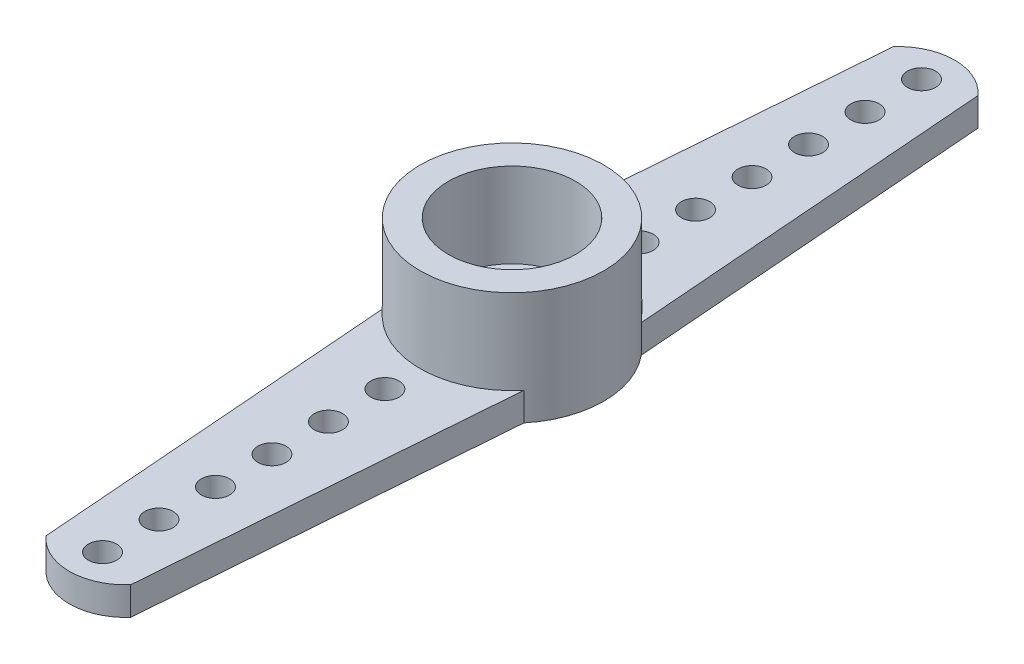
ISO-10303-21;
HEADER;
FILE_DESCRIPTION(('STEP AP214'),'2;1');
FILE_NAME('part.step','',(''),(''),'','','');
FILE_SCHEMA(('AUTOMOTIVE_DESIGN { 1 0 10303 214 1 1 1 1 }'));
ENDSEC;
DATA;
#1=APPLICATION_CONTEXT('core data for automotive mechanical design processes');
#2=APPLICATION_PROTOCOL_DEFINITION('international standard','automotive_design',2000,#1);
#3=PRODUCT_CONTEXT('',#1,'mechanical');
#4=PRODUCT('Part','Part','',(#3));
#5=PRODUCT_RELATED_PRODUCT_CATEGORY('part','',(#4));
#6=PRODUCT_DEFINITION_FORMATION('','',#4);
#7=PRODUCT_DEFINITION_CONTEXT('part definition',#1,'design');
#8=PRODUCT_DEFINITION('design','',#6,#7);
#9=PRODUCT_DEFINITION_SHAPE('','',#8);
#10=(LENGTH_UNIT() NAMED_UNIT(*) SI_UNIT(.MILLI.,.METRE.));
#11=(NAMED_UNIT(*) PLANE_ANGLE_UNIT() SI_UNIT($,.RADIAN.));
#12=(NAMED_UNIT(*) SI_UNIT($,.STERADIAN.) SOLID_ANGLE_UNIT());
#13=UNCERTAINTY_MEASURE_WITH_UNIT(LENGTH_MEASURE(1.E-05),#10,'distance_accuracy_value','');
#14=(GEOMETRIC_REPRESENTATION_CONTEXT(3) GLOBAL_UNCERTAINTY_ASSIGNED_CONTEXT((#13)) GLOBAL_UNIT_ASSIGNED_CONTEXT((#10,
#11,#12)) REPRESENTATION_CONTEXT('',''));
#15=CARTESIAN_POINT('',(0.,0.,0.));
#16=DIRECTION('',(0.,0.,1.));
#17=DIRECTION('',(1.,0.,0.));
#18=AXIS2_PLACEMENT_3D('',#15,#16,#17);
#19=CARTESIAN_POINT('',(0.,4.,0.));
#20=DIRECTION('',(0.,-1.,0.));
#21=DIRECTION('',(0.,0.,-1.));
#22=AXIS2_PLACEMENT_3D('',#19,#20,#21);
#23=CYLINDRICAL_SURFACE('',#22,3.25);
#24=CARTESIAN_POINT('',(0.,4.,0.));
#25=DIRECTION('',(0.,1.,0.));
#26=DIRECTION('',(0.,0.,1.));
#27=AXIS2_PLACEMENT_3D('',#24,#25,#26);
#28=CIRCLE('',#27,3.25);
#29=CARTESIAN_POINT('',(0.,4.,3.25));
#30=VERTEX_POINT('',#29);
#31=EDGE_CURVE('E47',#30,#30,#28,.T.);
#32=ORIENTED_EDGE('',*,*,#31,.F.);
#33=EDGE_LOOP('',(#32));
#34=FACE_BOUND('',#33,.T.);
#35=CARTESIAN_POINT('',(0.,0.,0.));
#36=DIRECTION('',(0.,1.,0.));
#37=DIRECTION('',(0.,0.,1.));
#38=AXIS2_PLACEMENT_3D('',#35,#36,#37);
#39=CIRCLE('',#38,3.25);
#40=CARTESIAN_POINT('',(-2.5,0.,-2.07665596572952));
#41=VERTEX_POINT('',#40);
#42=CARTESIAN_POINT('',(-2.5,0.,2.07665596572952));
#43=VERTEX_POINT('',#42);
#44=EDGE_CURVE('E232',#41,#43,#39,.T.);
#45=ORIENTED_EDGE('',*,*,#44,.T.);
#46=DIRECTION('',(0.,-1.,0.));
#47=VECTOR('',#46,1.);
#48=CARTESIAN_POINT('',(-2.5,1.,2.07665596572952));
#49=LINE('',#48,#47);
#50=CARTESIAN_POINT('',(-2.5,1.,2.07665596572952));
#51=VERTEX_POINT('',#50);
#52=EDGE_CURVE('E59',#51,#43,#49,.T.);
#53=ORIENTED_EDGE('',*,*,#52,.F.);
#54=CARTESIAN_POINT('',(0.,1.,0.));
#55=DIRECTION('',(0.,1.,0.));
#56=DIRECTION('',(0.,0.,1.));
#57=AXIS2_PLACEMENT_3D('',#54,#55,#56);
#58=CIRCLE('',#57,3.25);
#59=CARTESIAN_POINT('',(2.5,1.,2.07665596572952));
#60=VERTEX_POINT('',#59);
#61=EDGE_CURVE('E54',#51,#60,#58,.T.);
#62=ORIENTED_EDGE('',*,*,#61,.T.);
#63=DIRECTION('',(0.,-1.,0.));
#64=VECTOR('',#63,1.);
#65=CARTESIAN_POINT('',(2.5,1.,2.07665596572952));
#66=LINE('',#65,#64);
#67=CARTESIAN_POINT('',(2.5,0.,2.07665596572952));
#68=VERTEX_POINT('',#67);
#69=EDGE_CURVE('E160',#60,#68,#66,.T.);
#70=ORIENTED_EDGE('',*,*,#69,.T.);
#71=CARTESIAN_POINT('',(2.5,0.,-2.07665596572952));
#72=VERTEX_POINT('',#71);
#73=EDGE_CURVE('E228',#68,#72,#39,.T.);
#74=ORIENTED_EDGE('',*,*,#73,.T.);
#75=DIRECTION('',(0.,-1.,0.));
#76=VECTOR('',#75,1.);
#77=CARTESIAN_POINT('',(2.5,1.,-2.07665596572952));
#78=LINE('',#77,#76);
#79=CARTESIAN_POINT('',(2.5,1.,-2.07665596572952));
#80=VERTEX_POINT('',#79);
#81=EDGE_CURVE('E220',#80,#72,#78,.T.);
#82=ORIENTED_EDGE('',*,*,#81,.F.);
#83=CARTESIAN_POINT('',(0.,1.,0.));
#84=DIRECTION('',(0.,1.,0.));
#85=DIRECTION('',(0.,0.,1.));
#86=AXIS2_PLACEMENT_3D('',#83,#84,#85);
#87=CIRCLE('',#86,3.25);
#88=CARTESIAN_POINT('',(-2.5,1.,-2.07665596572952));
#89=VERTEX_POINT('',#88);
#90=EDGE_CURVE('E179',#80,#89,#87,.T.);
#91=ORIENTED_EDGE('',*,*,#90,.T.);
#92=DIRECTION('',(0.,-1.,0.));
#93=VECTOR('',#92,1.);
#94=CARTESIAN_POINT('',(-2.5,1.,-2.07665596572952));
#95=LINE('',#94,#93);
#96=EDGE_CURVE('E223',#89,#41,#95,.T.);
#97=ORIENTED_EDGE('',*,*,#96,.T.);
#98=EDGE_LOOP('',(#45,#53,#62,#70,#74,#82,#91,#97));
#99=FACE_BOUND('',#98,.T.);
#100=ADVANCED_FACE('F39',(#34,#99),#23,.T.);
#101=CARTESIAN_POINT('',(0.,4.,0.));
#102=DIRECTION('',(0.,-1.,0.));
#103=DIRECTION('',(0.,0.,-1.));
#104=AXIS2_PLACEMENT_3D('',#101,#102,#103);
#105=CYLINDRICAL_SURFACE('',#104,2.25);
#106=CARTESIAN_POINT('',(0.,1.,0.));
#107=DIRECTION('',(0.,1.,0.));
#108=DIRECTION('',(0.,0.,1.));
#109=AXIS2_PLACEMENT_3D('',#106,#107,#108);
#110=CIRCLE('',#109,2.25);
#111=CARTESIAN_POINT('',(0.,1.,2.25));
#112=VERTEX_POINT('',#111);
#113=EDGE_CURVE('E11',#112,#112,#110,.T.);
#114=ORIENTED_EDGE('',*,*,#113,.F.);
#115=EDGE_LOOP('',(#114));
#116=FACE_BOUND('',#115,.T.);
#117=CARTESIAN_POINT('',(0.,4.,0.));
#118=DIRECTION('',(0.,1.,0.));
#119=DIRECTION('',(0.,0.,1.));
#120=AXIS2_PLACEMENT_3D('',#117,#118,#119);
#121=CIRCLE('',#120,2.25);
#122=CARTESIAN_POINT('',(0.,4.,2.25));
#123=VERTEX_POINT('',#122);
#124=EDGE_CURVE('E229',#123,#123,#121,.T.);
#125=ORIENTED_EDGE('',*,*,#124,.T.);
#126=EDGE_LOOP('',(#125));
#127=FACE_BOUND('',#126,.T.);
#128=ADVANCED_FACE('F41',(#116,#127),#105,.F.);
#129=CARTESIAN_POINT('',(0.,4.,0.));
#130=DIRECTION('',(0.,1.,0.));
#131=DIRECTION('',(0.,0.,1.));
#132=AXIS2_PLACEMENT_3D('',#129,#130,#131);
#133=PLANE('',#132);
#134=ORIENTED_EDGE('',*,*,#124,.F.);
#135=EDGE_LOOP('',(#134));
#136=FACE_BOUND('',#135,.T.);
#137=ORIENTED_EDGE('',*,*,#31,.T.);
#138=EDGE_LOOP('',(#137));
#139=FACE_BOUND('',#138,.T.);
#140=ADVANCED_FACE('F273',(#136,#139),#133,.T.);
#141=CARTESIAN_POINT('',(0.,0.,0.));
#142=DIRECTION('',(0.,1.,0.));
#143=DIRECTION('',(0.,0.,1.));
#144=AXIS2_PLACEMENT_3D('',#141,#142,#143);
#145=PLANE('',#144);
#146=ORIENTED_EDGE('',*,*,#44,.F.);
#147=DIRECTION('',(-0.0771487312096737,0.,0.997019595230072));
#148=VECTOR('',#147,1.);
#149=CARTESIAN_POINT('',(-2.64485406135684,0.,-0.204657096053711));
#150=LINE('',#149,#148);
#151=CARTESIAN_POINT('',(-1.5,0.,-15.));
#152=VERTEX_POINT('',#151);
#153=EDGE_CURVE('E205',#152,#41,#150,.T.);
#154=ORIENTED_EDGE('',*,*,#153,.F.);
#155=CARTESIAN_POINT('',(0.,0.,-13.6771243444677));
#156=DIRECTION('',(0.,1.,0.));
#157=DIRECTION('',(0.,0.,1.));
#158=AXIS2_PLACEMENT_3D('',#155,#156,#157);
#159=CIRCLE('',#158,2.);
#160=CARTESIAN_POINT('',(1.5,0.,-15.));
#161=VERTEX_POINT('',#160);
#162=EDGE_CURVE('E202',#152,#161,#159,.F.);
#163=ORIENTED_EDGE('',*,*,#162,.T.);
#164=DIRECTION('',(0.0771487312096736,0.,0.997019595230073));
#165=VECTOR('',#164,1.);
#166=CARTESIAN_POINT('',(2.64485406135684,0.,-0.204657096053711));
#167=LINE('',#166,#165);
#168=EDGE_CURVE('E208',#161,#72,#167,.T.);
#169=ORIENTED_EDGE('',*,*,#168,.T.);
#170=ORIENTED_EDGE('',*,*,#73,.F.);
#171=DIRECTION('',(0.0771487312096736,0.,-0.997019595230073));
#172=VECTOR('',#171,1.);
#173=CARTESIAN_POINT('',(2.64485406135684,0.,0.204657096053711));
#174=LINE('',#173,#172);
#175=CARTESIAN_POINT('',(1.5,0.,15.));
#176=VERTEX_POINT('',#175);
#177=EDGE_CURVE('E155',#176,#68,#174,.T.);
#178=ORIENTED_EDGE('',*,*,#177,.F.);
#179=CARTESIAN_POINT('',(0.,0.,13.6771243444677));
#180=DIRECTION('',(0.,1.,0.));
#181=DIRECTION('',(0.,0.,1.));
#182=AXIS2_PLACEMENT_3D('',#179,#180,#181);
#183=CIRCLE('',#182,2.);
#184=CARTESIAN_POINT('',(-1.49999999999999,0.,15.));
#185=VERTEX_POINT('',#184);
#186=EDGE_CURVE('E153',#185,#176,#183,.T.);
#187=ORIENTED_EDGE('',*,*,#186,.F.);
#188=DIRECTION('',(-0.0771487312096742,0.,-0.997019595230072));
#189=VECTOR('',#188,1.);
#190=CARTESIAN_POINT('',(-2.64485406135684,0.,0.204657096053712));
#191=LINE('',#190,#189);
#192=EDGE_CURVE('E109',#185,#43,#191,.T.);
#193=ORIENTED_EDGE('',*,*,#192,.T.);
#194=EDGE_LOOP('',(#146,#154,#163,#169,#170,#178,#187,#193));
#195=FACE_BOUND('',#194,.T.);
#196=CARTESIAN_POINT('',(0.,0.,-12.5));
#197=DIRECTION('',(0.,1.,0.));
#198=DIRECTION('',(0.,0.,1.));
#199=AXIS2_PLACEMENT_3D('',#196,#197,#198);
#200=CIRCLE('',#199,0.5);
#201=CARTESIAN_POINT('',(0.,0.,-12.));
#202=VERTEX_POINT('',#201);
#203=EDGE_CURVE('E113',#202,#202,#200,.F.);
#204=ORIENTED_EDGE('',*,*,#203,.F.);
#205=EDGE_LOOP('',(#204));
#206=FACE_BOUND('',#205,.T.);
#207=CARTESIAN_POINT('',(0.,0.,-8.5));
#208=DIRECTION('',(0.,1.,0.));
#209=DIRECTION('',(0.,0.,1.));
#210=AXIS2_PLACEMENT_3D('',#207,#208,#209);
#211=CIRCLE('',#210,0.5);
#212=CARTESIAN_POINT('',(0.,0.,-8.));
#213=VERTEX_POINT('',#212);
#214=EDGE_CURVE('E196',#213,#213,#211,.F.);
#215=ORIENTED_EDGE('',*,*,#214,.F.);
#216=EDGE_LOOP('',(#215));
#217=FACE_BOUND('',#216,.T.);
#218=CARTESIAN_POINT('',(0.,0.,-4.5));
#219=DIRECTION('',(0.,1.,0.));
#220=DIRECTION('',(0.,0.,1.));
#221=AXIS2_PLACEMENT_3D('',#218,#219,#220);
#222=CIRCLE('',#221,0.5);
#223=CARTESIAN_POINT('',(0.,0.,-4.));
#224=VERTEX_POINT('',#223);
#225=EDGE_CURVE('E199',#224,#224,#222,.F.);
#226=ORIENTED_EDGE('',*,*,#225,.F.);
#227=EDGE_LOOP('',(#226));
#228=FACE_BOUND('',#227,.T.);
#229=CARTESIAN_POINT('',(0.,0.,-6.5));
#230=DIRECTION('',(0.,1.,0.));
#231=DIRECTION('',(0.,0.,1.));
#232=AXIS2_PLACEMENT_3D('',#229,#230,#231);
#233=CIRCLE('',#232,0.5);
#234=CARTESIAN_POINT('',(0.,0.,-6.));
#235=VERTEX_POINT('',#234);
#236=EDGE_CURVE('E211',#235,#235,#233,.F.);
#237=ORIENTED_EDGE('',*,*,#236,.F.);
#238=EDGE_LOOP('',(#237));
#239=FACE_BOUND('',#238,.T.);
#240=CARTESIAN_POINT('',(0.,0.,-10.5));
#241=DIRECTION('',(0.,1.,0.));
#242=DIRECTION('',(0.,0.,1.));
#243=AXIS2_PLACEMENT_3D('',#240,#241,#242);
#244=CIRCLE('',#243,0.5);
#245=CARTESIAN_POINT('',(0.,0.,-10.));
#246=VERTEX_POINT('',#245);
#247=EDGE_CURVE('E214',#246,#246,#244,.F.);
#248=ORIENTED_EDGE('',*,*,#247,.F.);
#249=EDGE_LOOP('',(#248));
#250=FACE_BOUND('',#249,.T.);
#251=CARTESIAN_POINT('',(0.,0.,-14.5));
#252=DIRECTION('',(0.,1.,0.));
#253=DIRECTION('',(0.,0.,1.));
#254=AXIS2_PLACEMENT_3D('',#251,#252,#253);
#255=CIRCLE('',#254,0.5);
#256=CARTESIAN_POINT('',(0.,0.,-14.));
#257=VERTEX_POINT('',#256);
#258=EDGE_CURVE('E167',#257,#257,#255,.F.);
#259=ORIENTED_EDGE('',*,*,#258,.F.);
#260=EDGE_LOOP('',(#259));
#261=FACE_BOUND('',#260,.T.);
#262=CARTESIAN_POINT('',(0.,0.,4.5));
#263=DIRECTION('',(0.,1.,0.));
#264=DIRECTION('',(0.,0.,1.));
#265=AXIS2_PLACEMENT_3D('',#262,#263,#264);
#266=CIRCLE('',#265,0.5);
#267=CARTESIAN_POINT('',(0.,0.,5.));
#268=VERTEX_POINT('',#267);
#269=EDGE_CURVE('E134',#268,#268,#266,.T.);
#270=ORIENTED_EDGE('',*,*,#269,.T.);
#271=EDGE_LOOP('',(#270));
#272=FACE_BOUND('',#271,.T.);
#273=CARTESIAN_POINT('',(0.,0.,6.5));
#274=DIRECTION('',(0.,1.,0.));
#275=DIRECTION('',(0.,0.,1.));
#276=AXIS2_PLACEMENT_3D('',#273,#274,#275);
#277=CIRCLE('',#276,0.5);
#278=CARTESIAN_POINT('',(0.,0.,7.));
#279=VERTEX_POINT('',#278);
#280=EDGE_CURVE('E137',#279,#279,#277,.T.);
#281=ORIENTED_EDGE('',*,*,#280,.T.);
#282=EDGE_LOOP('',(#281));
#283=FACE_BOUND('',#282,.T.);
#284=CARTESIAN_POINT('',(0.,0.,8.5));
#285=DIRECTION('',(0.,1.,0.));
#286=DIRECTION('',(0.,0.,1.));
#287=AXIS2_PLACEMENT_3D('',#284,#285,#286);
#288=CIRCLE('',#287,0.5);
#289=CARTESIAN_POINT('',(0.,0.,9.));
#290=VERTEX_POINT('',#289);
#291=EDGE_CURVE('E140',#290,#290,#288,.T.);
#292=ORIENTED_EDGE('',*,*,#291,.T.);
#293=EDGE_LOOP('',(#292));
#294=FACE_BOUND('',#293,.T.);
#295=CARTESIAN_POINT('',(0.,0.,10.5));
#296=DIRECTION('',(0.,1.,0.));
#297=DIRECTION('',(0.,0.,1.));
#298=AXIS2_PLACEMENT_3D('',#295,#296,#297);
#299=CIRCLE('',#298,0.5);
#300=CARTESIAN_POINT('',(0.,0.,11.));
#301=VERTEX_POINT('',#300);
#302=EDGE_CURVE('E143',#301,#301,#299,.T.);
#303=ORIENTED_EDGE('',*,*,#302,.T.);
#304=EDGE_LOOP('',(#303));
#305=FACE_BOUND('',#304,.T.);
#306=CARTESIAN_POINT('',(0.,0.,12.5));
#307=DIRECTION('',(0.,1.,0.));
#308=DIRECTION('',(0.,0.,1.));
#309=AXIS2_PLACEMENT_3D('',#306,#307,#308);
#310=CIRCLE('',#309,0.5);
#311=CARTESIAN_POINT('',(0.,0.,13.));
#312=VERTEX_POINT('',#311);
#313=EDGE_CURVE('E146',#312,#312,#310,.T.);
#314=ORIENTED_EDGE('',*,*,#313,.T.);
#315=EDGE_LOOP('',(#314));
#316=FACE_BOUND('',#315,.T.);
#317=CARTESIAN_POINT('',(0.,0.,14.5));
#318=DIRECTION('',(0.,1.,0.));
#319=DIRECTION('',(0.,0.,1.));
#320=AXIS2_PLACEMENT_3D('',#317,#318,#319);
#321=CIRCLE('',#320,0.5);
#322=CARTESIAN_POINT('',(0.,0.,15.));
#323=VERTEX_POINT('',#322);
#324=EDGE_CURVE('E149',#323,#323,#321,.T.);
#325=ORIENTED_EDGE('',*,*,#324,.T.);
#326=EDGE_LOOP('',(#325));
#327=FACE_BOUND('',#326,.T.);
#328=ADVANCED_FACE('F241',(#195,#206,#217,#228,#239,#250,#261,#272,#283,#294,#305,#316,#327),
#145,.F.);
#329=CARTESIAN_POINT('',(0.,1.,0.));
#330=DIRECTION('',(0.,1.,0.));
#331=DIRECTION('',(0.,0.,1.));
#332=AXIS2_PLACEMENT_3D('',#329,#330,#331);
#333=PLANE('',#332);
#334=ORIENTED_EDGE('',*,*,#113,.T.);
#335=EDGE_LOOP('',(#334));
#336=FACE_BOUND('',#335,.T.);
#337=ADVANCED_FACE('F265',(#336),#333,.T.);
#338=CARTESIAN_POINT('',(0.,1.,-13.6771243444677));
#339=DIRECTION('',(0.,-1.,0.));
#340=DIRECTION('',(0.,0.,-1.));
#341=AXIS2_PLACEMENT_3D('',#338,#339,#340);
#342=CYLINDRICAL_SURFACE('',#341,2.);
#343=ORIENTED_EDGE('',*,*,#162,.F.);
#344=DIRECTION('',(0.,-1.,0.));
#345=VECTOR('',#344,1.);
#346=CARTESIAN_POINT('',(-1.5,1.,-15.));
#347=LINE('',#346,#345);
#348=CARTESIAN_POINT('',(-1.5,1.,-15.));
#349=VERTEX_POINT('',#348);
#350=EDGE_CURVE('E226',#349,#152,#347,.T.);
#351=ORIENTED_EDGE('',*,*,#350,.F.);
#352=CARTESIAN_POINT('',(0.,1.,-13.6771243444677));
#353=DIRECTION('',(0.,1.,0.));
#354=DIRECTION('',(0.,0.,1.));
#355=AXIS2_PLACEMENT_3D('',#352,#353,#354);
#356=CIRCLE('',#355,2.);
#357=CARTESIAN_POINT('',(1.5,1.,-15.));
#358=VERTEX_POINT('',#357);
#359=EDGE_CURVE('E173',#349,#358,#356,.F.);
#360=ORIENTED_EDGE('',*,*,#359,.T.);
#361=DIRECTION('',(0.,-1.,0.));
#362=VECTOR('',#361,1.);
#363=CARTESIAN_POINT('',(1.5,1.,-15.));
#364=LINE('',#363,#362);
#365=EDGE_CURVE('E193',#358,#161,#364,.T.);
#366=ORIENTED_EDGE('',*,*,#365,.T.);
#367=EDGE_LOOP('',(#343,#351,#360,#366));
#368=FACE_BOUND('',#367,.T.);
#369=ADVANCED_FACE('F246',(#368),#342,.T.);
#370=CARTESIAN_POINT('',(-2.64485406135684,1.,-0.204657096053711));
#371=DIRECTION('',(0.997019595230073,0.,0.0771487312096737));
#372=DIRECTION('',(0.0771487312096737,0.,-0.997019595230073));
#373=AXIS2_PLACEMENT_3D('',#370,#371,#372);
#374=PLANE('',#373);
#375=ORIENTED_EDGE('',*,*,#153,.T.);
#376=ORIENTED_EDGE('',*,*,#96,.F.);
#377=DIRECTION('',(-0.0771487312096737,0.,0.997019595230072));
#378=VECTOR('',#377,1.);
#379=CARTESIAN_POINT('',(-2.64485406135684,1.,-0.204657096053711));
#380=LINE('',#379,#378);
#381=EDGE_CURVE('E176',#349,#89,#380,.T.);
#382=ORIENTED_EDGE('',*,*,#381,.F.);
#383=ORIENTED_EDGE('',*,*,#350,.T.);
#384=EDGE_LOOP('',(#375,#376,#382,#383));
#385=FACE_BOUND('',#384,.T.);
#386=ADVANCED_FACE('F254',(#385),#374,.F.);
#387=CARTESIAN_POINT('',(0.,1.,-10.5));
#388=DIRECTION('',(0.,-1.,0.));
#389=DIRECTION('',(0.,0.,-1.));
#390=AXIS2_PLACEMENT_3D('',#387,#388,#389);
#391=CYLINDRICAL_SURFACE('',#390,0.5);
#392=CARTESIAN_POINT('',(0.,1.,-10.5));
#393=DIRECTION('',(0.,1.,0.));
#394=DIRECTION('',(0.,0.,1.));
#395=AXIS2_PLACEMENT_3D('',#392,#393,#394);
#396=CIRCLE('',#395,0.5);
#397=CARTESIAN_POINT('',(0.,1.,-10.));
#398=VERTEX_POINT('',#397);
#399=EDGE_CURVE('E187',#398,#398,#396,.F.);
#400=ORIENTED_EDGE('',*,*,#399,.F.);
#401=EDGE_LOOP('',(#400));
#402=FACE_BOUND('',#401,.T.);
#403=ORIENTED_EDGE('',*,*,#247,.T.);
#404=EDGE_LOOP('',(#403));
#405=FACE_BOUND('',#404,.T.);
#406=ADVANCED_FACE('F256',(#402,#405),#391,.F.);
#407=CARTESIAN_POINT('',(0.,1.,-6.5));
#408=DIRECTION('',(0.,-1.,0.));
#409=DIRECTION('',(0.,0.,-1.));
#410=AXIS2_PLACEMENT_3D('',#407,#408,#409);
#411=CYLINDRICAL_SURFACE('',#410,0.5);
#412=CARTESIAN_POINT('',(0.,1.,-6.5));
#413=DIRECTION('',(0.,1.,0.));
#414=DIRECTION('',(0.,0.,1.));
#415=AXIS2_PLACEMENT_3D('',#412,#413,#414);
#416=CIRCLE('',#415,0.5);
#417=CARTESIAN_POINT('',(0.,1.,-6.));
#418=VERTEX_POINT('',#417);
#419=EDGE_CURVE('E184',#418,#418,#416,.F.);
#420=ORIENTED_EDGE('',*,*,#419,.F.);
#421=EDGE_LOOP('',(#420));
#422=FACE_BOUND('',#421,.T.);
#423=ORIENTED_EDGE('',*,*,#236,.T.);
#424=EDGE_LOOP('',(#423));
#425=FACE_BOUND('',#424,.T.);
#426=ADVANCED_FACE('F262',(#422,#425),#411,.F.);
#427=CARTESIAN_POINT('',(2.64485406135684,1.,-0.204657096053711));
#428=DIRECTION('',(0.997019595230073,0.,-0.0771487312096736));
#429=DIRECTION('',(-0.0771487312096736,0.,-0.997019595230073));
#430=AXIS2_PLACEMENT_3D('',#427,#428,#429);
#431=PLANE('',#430);
#432=ORIENTED_EDGE('',*,*,#168,.F.);
#433=ORIENTED_EDGE('',*,*,#365,.F.);
#434=DIRECTION('',(0.0771487312096736,0.,0.997019595230073));
#435=VECTOR('',#434,1.);
#436=CARTESIAN_POINT('',(2.64485406135684,1.,-0.204657096053711));
#437=LINE('',#436,#435);
#438=EDGE_CURVE('E181',#358,#80,#437,.T.);
#439=ORIENTED_EDGE('',*,*,#438,.T.);
#440=ORIENTED_EDGE('',*,*,#81,.T.);
#441=EDGE_LOOP('',(#432,#433,#439,#440));
#442=FACE_BOUND('',#441,.T.);
#443=ADVANCED_FACE('F239',(#442),#431,.T.);
#444=CARTESIAN_POINT('',(0.,1.,-4.5));
#445=DIRECTION('',(0.,-1.,0.));
#446=DIRECTION('',(0.,0.,-1.));
#447=AXIS2_PLACEMENT_3D('',#444,#445,#446);
#448=CYLINDRICAL_SURFACE('',#447,0.5);
#449=CARTESIAN_POINT('',(0.,1.,-4.5));
#450=DIRECTION('',(0.,1.,0.));
#451=DIRECTION('',(0.,0.,1.));
#452=AXIS2_PLACEMENT_3D('',#449,#450,#451);
#453=CIRCLE('',#452,0.5);
#454=CARTESIAN_POINT('',(0.,1.,-4.));
#455=VERTEX_POINT('',#454);
#456=EDGE_CURVE('E170',#455,#455,#453,.F.);
#457=ORIENTED_EDGE('',*,*,#456,.F.);
#458=EDGE_LOOP('',(#457));
#459=FACE_BOUND('',#458,.T.);
#460=ORIENTED_EDGE('',*,*,#225,.T.);
#461=EDGE_LOOP('',(#460));
#462=FACE_BOUND('',#461,.T.);
#463=ADVANCED_FACE('F293',(#459,#462),#448,.F.);
#464=CARTESIAN_POINT('',(0.,1.,-8.5));
#465=DIRECTION('',(0.,-1.,0.));
#466=DIRECTION('',(0.,0.,-1.));
#467=AXIS2_PLACEMENT_3D('',#464,#465,#466);
#468=CYLINDRICAL_SURFACE('',#467,0.5);
#469=CARTESIAN_POINT('',(0.,1.,-8.5));
#470=DIRECTION('',(0.,1.,0.));
#471=DIRECTION('',(0.,0.,1.));
#472=AXIS2_PLACEMENT_3D('',#469,#470,#471);
#473=CIRCLE('',#472,0.5);
#474=CARTESIAN_POINT('',(0.,1.,-8.));
#475=VERTEX_POINT('',#474);
#476=EDGE_CURVE('E166',#475,#475,#473,.F.);
#477=ORIENTED_EDGE('',*,*,#476,.F.);
#478=EDGE_LOOP('',(#477));
#479=FACE_BOUND('',#478,.T.);
#480=ORIENTED_EDGE('',*,*,#214,.T.);
#481=EDGE_LOOP('',(#480));
#482=FACE_BOUND('',#481,.T.);
#483=ADVANCED_FACE('F289',(#479,#482),#468,.F.);
#484=CARTESIAN_POINT('',(0.,1.,-12.5));
#485=DIRECTION('',(0.,-1.,0.));
#486=DIRECTION('',(0.,0.,-1.));
#487=AXIS2_PLACEMENT_3D('',#484,#485,#486);
#488=CYLINDRICAL_SURFACE('',#487,0.5);
#489=CARTESIAN_POINT('',(0.,1.,-12.5));
#490=DIRECTION('',(0.,1.,0.));
#491=DIRECTION('',(0.,0.,1.));
#492=AXIS2_PLACEMENT_3D('',#489,#490,#491);
#493=CIRCLE('',#492,0.5);
#494=CARTESIAN_POINT('',(0.,1.,-12.));
#495=VERTEX_POINT('',#494);
#496=EDGE_CURVE('E163',#495,#495,#493,.F.);
#497=ORIENTED_EDGE('',*,*,#496,.F.);
#498=EDGE_LOOP('',(#497));
#499=FACE_BOUND('',#498,.T.);
#500=ORIENTED_EDGE('',*,*,#203,.T.);
#501=EDGE_LOOP('',(#500));
#502=FACE_BOUND('',#501,.T.);
#503=ADVANCED_FACE('F285',(#499,#502),#488,.F.);
#504=CARTESIAN_POINT('',(0.,1.,-14.5));
#505=DIRECTION('',(0.,-1.,0.));
#506=DIRECTION('',(0.,0.,-1.));
#507=AXIS2_PLACEMENT_3D('',#504,#505,#506);
#508=CYLINDRICAL_SURFACE('',#507,0.5);
#509=CARTESIAN_POINT('',(0.,1.,-14.5));
#510=DIRECTION('',(0.,1.,0.));
#511=DIRECTION('',(0.,0.,1.));
#512=AXIS2_PLACEMENT_3D('',#509,#510,#511);
#513=CIRCLE('',#512,0.5);
#514=CARTESIAN_POINT('',(0.,1.,-14.));
#515=VERTEX_POINT('',#514);
#516=EDGE_CURVE('E190',#515,#515,#513,.F.);
#517=ORIENTED_EDGE('',*,*,#516,.F.);
#518=EDGE_LOOP('',(#517));
#519=FACE_BOUND('',#518,.T.);
#520=ORIENTED_EDGE('',*,*,#258,.T.);
#521=EDGE_LOOP('',(#520));
#522=FACE_BOUND('',#521,.T.);
#523=ADVANCED_FACE('F288',(#519,#522),#508,.F.);
#524=CARTESIAN_POINT('',(0.,1.,0.));
#525=DIRECTION('',(0.,1.,0.));
#526=DIRECTION('',(0.,0.,1.));
#527=AXIS2_PLACEMENT_3D('',#524,#525,#526);
#528=PLANE('',#527);
#529=ORIENTED_EDGE('',*,*,#496,.T.);
#530=EDGE_LOOP('',(#529));
#531=FACE_BOUND('',#530,.T.);
#532=ORIENTED_EDGE('',*,*,#476,.T.);
#533=EDGE_LOOP('',(#532));
#534=FACE_BOUND('',#533,.T.);
#535=ORIENTED_EDGE('',*,*,#456,.T.);
#536=EDGE_LOOP('',(#535));
#537=FACE_BOUND('',#536,.T.);
#538=ORIENTED_EDGE('',*,*,#359,.F.);
#539=ORIENTED_EDGE('',*,*,#381,.T.);
#540=ORIENTED_EDGE('',*,*,#90,.F.);
#541=ORIENTED_EDGE('',*,*,#438,.F.);
#542=EDGE_LOOP('',(#538,#539,#540,#541));
#543=FACE_BOUND('',#542,.T.);
#544=ORIENTED_EDGE('',*,*,#419,.T.);
#545=EDGE_LOOP('',(#544));
#546=FACE_BOUND('',#545,.T.);
#547=ORIENTED_EDGE('',*,*,#399,.T.);
#548=EDGE_LOOP('',(#547));
#549=FACE_BOUND('',#548,.T.);
#550=ORIENTED_EDGE('',*,*,#516,.T.);
#551=EDGE_LOOP('',(#550));
#552=FACE_BOUND('',#551,.T.);
#553=ADVANCED_FACE('F250',(#531,#534,#537,#543,#546,#549,#552),#528,.T.);
#554=CARTESIAN_POINT('',(-2.64485406135684,1.,0.204657096053712));
#555=DIRECTION('',(-0.997019595230073,0.,0.0771487312096742));
#556=DIRECTION('',(0.0771487312096742,0.,0.997019595230073));
#557=AXIS2_PLACEMENT_3D('',#554,#555,#556);
#558=PLANE('',#557);
#559=ORIENTED_EDGE('',*,*,#192,.F.);
#560=DIRECTION('',(0.,-1.,0.));
#561=VECTOR('',#560,1.);
#562=CARTESIAN_POINT('',(-1.49999999999999,1.,15.));
#563=LINE('',#562,#561);
#564=CARTESIAN_POINT('',(-1.49999999999999,1.,15.));
#565=VERTEX_POINT('',#564);
#566=EDGE_CURVE('E103',#565,#185,#563,.T.);
#567=ORIENTED_EDGE('',*,*,#566,.F.);
#568=DIRECTION('',(-0.0771487312096742,0.,-0.997019595230072));
#569=VECTOR('',#568,1.);
#570=CARTESIAN_POINT('',(-2.64485406135684,1.,0.204657096053712));
#571=LINE('',#570,#569);
#572=EDGE_CURVE('E107',#565,#51,#571,.T.);
#573=ORIENTED_EDGE('',*,*,#572,.T.);
#574=ORIENTED_EDGE('',*,*,#52,.T.);
#575=EDGE_LOOP('',(#559,#567,#573,#574));
#576=FACE_BOUND('',#575,.T.);
#577=ADVANCED_FACE('F105',(#576),#558,.T.);
#578=CARTESIAN_POINT('',(0.,1.,13.6771243444677));
#579=DIRECTION('',(0.,-1.,0.));
#580=DIRECTION('',(0.,0.,-1.));
#581=AXIS2_PLACEMENT_3D('',#578,#579,#580);
#582=CYLINDRICAL_SURFACE('',#581,2.);
#583=ORIENTED_EDGE('',*,*,#186,.T.);
#584=DIRECTION('',(0.,-1.,0.));
#585=VECTOR('',#584,1.);
#586=CARTESIAN_POINT('',(1.5,1.,15.));
#587=LINE('',#586,#585);
#588=CARTESIAN_POINT('',(1.5,1.,15.));
#589=VERTEX_POINT('',#588);
#590=EDGE_CURVE('E114',#589,#176,#587,.T.);
#591=ORIENTED_EDGE('',*,*,#590,.F.);
#592=CARTESIAN_POINT('',(0.,1.,13.6771243444677));
#593=DIRECTION('',(0.,1.,0.));
#594=DIRECTION('',(0.,0.,1.));
#595=AXIS2_PLACEMENT_3D('',#592,#593,#594);
#596=CIRCLE('',#595,2.);
#597=EDGE_CURVE('E118',#565,#589,#596,.T.);
#598=ORIENTED_EDGE('',*,*,#597,.F.);
#599=ORIENTED_EDGE('',*,*,#566,.T.);
#600=EDGE_LOOP('',(#583,#591,#598,#599));
#601=FACE_BOUND('',#600,.T.);
#602=ADVANCED_FACE('F119',(#601),#582,.T.);
#603=CARTESIAN_POINT('',(2.64485406135684,1.,0.204657096053711));
#604=DIRECTION('',(-0.997019595230073,0.,-0.0771487312096736));
#605=DIRECTION('',(-0.0771487312096736,0.,0.997019595230073));
#606=AXIS2_PLACEMENT_3D('',#603,#604,#605);
#607=PLANE('',#606);
#608=ORIENTED_EDGE('',*,*,#177,.T.);
#609=ORIENTED_EDGE('',*,*,#69,.F.);
#610=DIRECTION('',(0.0771487312096736,0.,-0.997019595230073));
#611=VECTOR('',#610,1.);
#612=CARTESIAN_POINT('',(2.64485406135684,1.,0.204657096053711));
#613=LINE('',#612,#611);
#614=EDGE_CURVE('E122',#589,#60,#613,.T.);
#615=ORIENTED_EDGE('',*,*,#614,.F.);
#616=ORIENTED_EDGE('',*,*,#590,.T.);
#617=EDGE_LOOP('',(#608,#609,#615,#616));
#618=FACE_BOUND('',#617,.T.);
#619=ADVANCED_FACE('F326',(#618),#607,.F.);
#620=CARTESIAN_POINT('',(0.,1.,14.5));
#621=DIRECTION('',(0.,-1.,0.));
#622=DIRECTION('',(0.,0.,-1.));
#623=AXIS2_PLACEMENT_3D('',#620,#621,#622);
#624=CYLINDRICAL_SURFACE('',#623,0.5);
#625=CARTESIAN_POINT('',(0.,1.,14.5));
#626=DIRECTION('',(0.,1.,0.));
#627=DIRECTION('',(0.,0.,1.));
#628=AXIS2_PLACEMENT_3D('',#625,#626,#627);
#629=CIRCLE('',#628,0.5);
#630=CARTESIAN_POINT('',(0.,1.,15.));
#631=VERTEX_POINT('',#630);
#632=EDGE_CURVE('E125',#631,#631,#629,.T.);
#633=ORIENTED_EDGE('',*,*,#632,.T.);
#634=EDGE_LOOP('',(#633));
#635=FACE_BOUND('',#634,.T.);
#636=ORIENTED_EDGE('',*,*,#324,.F.);
#637=EDGE_LOOP('',(#636));
#638=FACE_BOUND('',#637,.T.);
#639=ADVANCED_FACE('F323',(#635,#638),#624,.F.);
#640=CARTESIAN_POINT('',(0.,1.,12.5));
#641=DIRECTION('',(0.,-1.,0.));
#642=DIRECTION('',(0.,0.,-1.));
#643=AXIS2_PLACEMENT_3D('',#640,#641,#642);
#644=CYLINDRICAL_SURFACE('',#643,0.5);
#645=CARTESIAN_POINT('',(0.,1.,12.5));
#646=DIRECTION('',(0.,1.,0.));
#647=DIRECTION('',(0.,0.,1.));
#648=AXIS2_PLACEMENT_3D('',#645,#646,#647);
#649=CIRCLE('',#648,0.5);
#650=CARTESIAN_POINT('',(0.,1.,13.));
#651=VERTEX_POINT('',#650);
#652=EDGE_CURVE('E128',#651,#651,#649,.T.);
#653=ORIENTED_EDGE('',*,*,#652,.T.);
#654=EDGE_LOOP('',(#653));
#655=FACE_BOUND('',#654,.T.);
#656=ORIENTED_EDGE('',*,*,#313,.F.);
#657=EDGE_LOOP('',(#656));
#658=FACE_BOUND('',#657,.T.);
#659=ADVANCED_FACE('F325',(#655,#658),#644,.F.);
#660=CARTESIAN_POINT('',(0.,1.,10.5));
#661=DIRECTION('',(0.,-1.,0.));
#662=DIRECTION('',(0.,0.,-1.));
#663=AXIS2_PLACEMENT_3D('',#660,#661,#662);
#664=CYLINDRICAL_SURFACE('',#663,0.5);
#665=CARTESIAN_POINT('',(0.,1.,10.5));
#666=DIRECTION('',(0.,1.,0.));
#667=DIRECTION('',(0.,0.,1.));
#668=AXIS2_PLACEMENT_3D('',#665,#666,#667);
#669=CIRCLE('',#668,0.5);
#670=CARTESIAN_POINT('',(0.,1.,11.));
#671=VERTEX_POINT('',#670);
#672=EDGE_CURVE('E501',#671,#671,#669,.T.);
#673=ORIENTED_EDGE('',*,*,#672,.T.);
#674=EDGE_LOOP('',(#673));
#675=FACE_BOUND('',#674,.T.);
#676=ORIENTED_EDGE('',*,*,#302,.F.);
#677=EDGE_LOOP('',(#676));
#678=FACE_BOUND('',#677,.T.);
#679=ADVANCED_FACE('F333',(#675,#678),#664,.F.);
#680=CARTESIAN_POINT('',(0.,1.,8.5));
#681=DIRECTION('',(0.,-1.,0.));
#682=DIRECTION('',(0.,0.,-1.));
#683=AXIS2_PLACEMENT_3D('',#680,#681,#682);
#684=CYLINDRICAL_SURFACE('',#683,0.5);
#685=CARTESIAN_POINT('',(0.,1.,8.5));
#686=DIRECTION('',(0.,1.,0.));
#687=DIRECTION('',(0.,0.,1.));
#688=AXIS2_PLACEMENT_3D('',#685,#686,#687);
#689=CIRCLE('',#688,0.5);
#690=CARTESIAN_POINT('',(0.,1.,9.));
#691=VERTEX_POINT('',#690);
#692=EDGE_CURVE('E497',#691,#691,#689,.T.);
#693=ORIENTED_EDGE('',*,*,#692,.T.);
#694=EDGE_LOOP('',(#693));
#695=FACE_BOUND('',#694,.T.);
#696=ORIENTED_EDGE('',*,*,#291,.F.);
#697=EDGE_LOOP('',(#696));
#698=FACE_BOUND('',#697,.T.);
#699=ADVANCED_FACE('F343',(#695,#698),#684,.F.);
#700=CARTESIAN_POINT('',(0.,1.,6.5));
#701=DIRECTION('',(0.,-1.,0.));
#702=DIRECTION('',(0.,0.,-1.));
#703=AXIS2_PLACEMENT_3D('',#700,#701,#702);
#704=CYLINDRICAL_SURFACE('',#703,0.5);
#705=CARTESIAN_POINT('',(0.,1.,6.5));
#706=DIRECTION('',(0.,1.,0.));
#707=DIRECTION('',(0.,0.,1.));
#708=AXIS2_PLACEMENT_3D('',#705,#706,#707);
#709=CIRCLE('',#708,0.5);
#710=CARTESIAN_POINT('',(0.,1.,7.));
#711=VERTEX_POINT('',#710);
#712=EDGE_CURVE('E493',#711,#711,#709,.T.);
#713=ORIENTED_EDGE('',*,*,#712,.T.);
#714=EDGE_LOOP('',(#713));
#715=FACE_BOUND('',#714,.T.);
#716=ORIENTED_EDGE('',*,*,#280,.F.);
#717=EDGE_LOOP('',(#716));
#718=FACE_BOUND('',#717,.T.);
#719=ADVANCED_FACE('F347',(#715,#718),#704,.F.);
#720=CARTESIAN_POINT('',(0.,1.,4.5));
#721=DIRECTION('',(0.,-1.,0.));
#722=DIRECTION('',(0.,0.,-1.));
#723=AXIS2_PLACEMENT_3D('',#720,#721,#722);
#724=CYLINDRICAL_SURFACE('',#723,0.5);
#725=CARTESIAN_POINT('',(0.,1.,4.5));
#726=DIRECTION('',(0.,1.,0.));
#727=DIRECTION('',(0.,0.,1.));
#728=AXIS2_PLACEMENT_3D('',#725,#726,#727);
#729=CIRCLE('',#728,0.5);
#730=CARTESIAN_POINT('',(0.,1.,5.));
#731=VERTEX_POINT('',#730);
#732=EDGE_CURVE('E158',#731,#731,#729,.T.);
#733=ORIENTED_EDGE('',*,*,#732,.T.);
#734=EDGE_LOOP('',(#733));
#735=FACE_BOUND('',#734,.T.);
#736=ORIENTED_EDGE('',*,*,#269,.F.);
#737=EDGE_LOOP('',(#736));
#738=FACE_BOUND('',#737,.T.);
#739=ADVANCED_FACE('F351',(#735,#738),#724,.F.);
#740=CARTESIAN_POINT('',(0.,1.,0.));
#741=DIRECTION('',(0.,1.,0.));
#742=DIRECTION('',(0.,0.,1.));
#743=AXIS2_PLACEMENT_3D('',#740,#741,#742);
#744=PLANE('',#743);
#745=ORIENTED_EDGE('',*,*,#732,.F.);
#746=EDGE_LOOP('',(#745));
#747=FACE_BOUND('',#746,.T.);
#748=ORIENTED_EDGE('',*,*,#712,.F.);
#749=EDGE_LOOP('',(#748));
#750=FACE_BOUND('',#749,.T.);
#751=ORIENTED_EDGE('',*,*,#692,.F.);
#752=EDGE_LOOP('',(#751));
#753=FACE_BOUND('',#752,.T.);
#754=ORIENTED_EDGE('',*,*,#672,.F.);
#755=EDGE_LOOP('',(#754));
#756=FACE_BOUND('',#755,.T.);
#757=ORIENTED_EDGE('',*,*,#652,.F.);
#758=EDGE_LOOP('',(#757));
#759=FACE_BOUND('',#758,.T.);
#760=ORIENTED_EDGE('',*,*,#632,.F.);
#761=EDGE_LOOP('',(#760));
#762=FACE_BOUND('',#761,.T.);
#763=ORIENTED_EDGE('',*,*,#572,.F.);
#764=ORIENTED_EDGE('',*,*,#597,.T.);
#765=ORIENTED_EDGE('',*,*,#614,.T.);
#766=ORIENTED_EDGE('',*,*,#61,.F.);
#767=EDGE_LOOP('',(#763,#764,#765,#766));
#768=FACE_BOUND('',#767,.T.);
#769=ADVANCED_FACE('F124',(#747,#750,#753,#756,#759,#762,#768),#744,.T.);
#770=CLOSED_SHELL('',(#100,#128,#140,#328,#337,#369,#386,#406,#426,#443,#463,#483,#503,#523,
#553,#577,#602,#619,#639,#659,#679,#699,#719,#739,#769));
#771=MANIFOLD_SOLID_BREP('B2',#770);
#772=ADVANCED_BREP_SHAPE_REPRESENTATION('',(#18,#771),#14);
#773=SHAPE_DEFINITION_REPRESENTATION(#9,#772);
ENDSEC;
END-ISO-10303-21;
